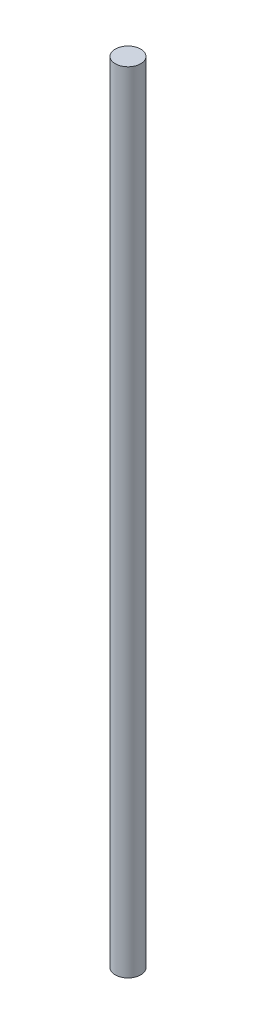
ISO-10303-21;
HEADER;
FILE_DESCRIPTION(('STEP AP214'),'2;1');
FILE_NAME('part.step','',(''),(''),'','','');
FILE_SCHEMA(('AUTOMOTIVE_DESIGN { 1 0 10303 214 1 1 1 1 }'));
ENDSEC;
DATA;
#1=APPLICATION_CONTEXT('core data for automotive mechanical design processes');
#2=APPLICATION_PROTOCOL_DEFINITION('international standard','automotive_design',2000,#1);
#3=PRODUCT_CONTEXT('',#1,'mechanical');
#4=PRODUCT('Part','Part','',(#3));
#5=PRODUCT_RELATED_PRODUCT_CATEGORY('part','',(#4));
#6=PRODUCT_DEFINITION_FORMATION('','',#4);
#7=PRODUCT_DEFINITION_CONTEXT('part definition',#1,'design');
#8=PRODUCT_DEFINITION('design','',#6,#7);
#9=PRODUCT_DEFINITION_SHAPE('','',#8);
#10=(LENGTH_UNIT() NAMED_UNIT(*) SI_UNIT(.MILLI.,.METRE.));
#11=(NAMED_UNIT(*) PLANE_ANGLE_UNIT() SI_UNIT($,.RADIAN.));
#12=(NAMED_UNIT(*) SI_UNIT($,.STERADIAN.) SOLID_ANGLE_UNIT());
#13=UNCERTAINTY_MEASURE_WITH_UNIT(LENGTH_MEASURE(1.E-05),#10,'distance_accuracy_value','');
#14=(GEOMETRIC_REPRESENTATION_CONTEXT(3) GLOBAL_UNCERTAINTY_ASSIGNED_CONTEXT((#13)) GLOBAL_UNIT_ASSIGNED_CONTEXT((#10,
#11,#12)) REPRESENTATION_CONTEXT('',''));
#15=CARTESIAN_POINT('',(0.,0.,0.));
#16=DIRECTION('',(0.,0.,1.));
#17=DIRECTION('',(1.,0.,0.));
#18=AXIS2_PLACEMENT_3D('',#15,#16,#17);
#19=CARTESIAN_POINT('',(0.,124.,0.));
#20=DIRECTION('',(0.,-1.,0.));
#21=DIRECTION('',(0.,0.,-1.));
#22=AXIS2_PLACEMENT_3D('',#19,#20,#21);
#23=CYLINDRICAL_SURFACE('',#22,2.);
#24=CARTESIAN_POINT('',(0.,124.,0.));
#25=DIRECTION('',(0.,1.,0.));
#26=DIRECTION('',(0.,0.,1.));
#27=AXIS2_PLACEMENT_3D('',#24,#25,#26);
#28=CIRCLE('',#27,2.);
#29=CARTESIAN_POINT('',(0.,124.,2.));
#30=VERTEX_POINT('',#29);
#31=EDGE_CURVE('E10',#30,#30,#28,.T.);
#32=ORIENTED_EDGE('',*,*,#31,.F.);
#33=EDGE_LOOP('',(#32));
#34=FACE_BOUND('',#33,.T.);
#35=CARTESIAN_POINT('',(0.,0.,0.));
#36=DIRECTION('',(0.,1.,0.));
#37=DIRECTION('',(0.,0.,1.));
#38=AXIS2_PLACEMENT_3D('',#35,#36,#37);
#39=CIRCLE('',#38,2.);
#40=CARTESIAN_POINT('',(0.,0.,2.));
#41=VERTEX_POINT('',#40);
#42=EDGE_CURVE('E34',#41,#41,#39,.T.);
#43=ORIENTED_EDGE('',*,*,#42,.T.);
#44=EDGE_LOOP('',(#43));
#45=FACE_BOUND('',#44,.T.);
#46=ADVANCED_FACE('F31',(#34,#45),#23,.T.);
#47=CARTESIAN_POINT('',(0.,124.,0.));
#48=DIRECTION('',(0.,1.,0.));
#49=DIRECTION('',(0.,0.,1.));
#50=AXIS2_PLACEMENT_3D('',#47,#48,#49);
#51=PLANE('',#50);
#52=ORIENTED_EDGE('',*,*,#31,.T.);
#53=EDGE_LOOP('',(#52));
#54=FACE_BOUND('',#53,.T.);
#55=ADVANCED_FACE('F46',(#54),#51,.T.);
#56=CARTESIAN_POINT('',(0.,0.,0.));
#57=DIRECTION('',(0.,1.,0.));
#58=DIRECTION('',(0.,0.,1.));
#59=AXIS2_PLACEMENT_3D('',#56,#57,#58);
#60=PLANE('',#59);
#61=ORIENTED_EDGE('',*,*,#42,.F.);
#62=EDGE_LOOP('',(#61));
#63=FACE_BOUND('',#62,.T.);
#64=ADVANCED_FACE('F44',(#63),#60,.F.);
#65=CLOSED_SHELL('',(#46,#55,#64));
#66=MANIFOLD_SOLID_BREP('B2',#65);
#67=ADVANCED_BREP_SHAPE_REPRESENTATION('',(#18,#66),#14);
#68=SHAPE_DEFINITION_REPRESENTATION(#9,#67);
ENDSEC;
END-ISO-10303-21;
